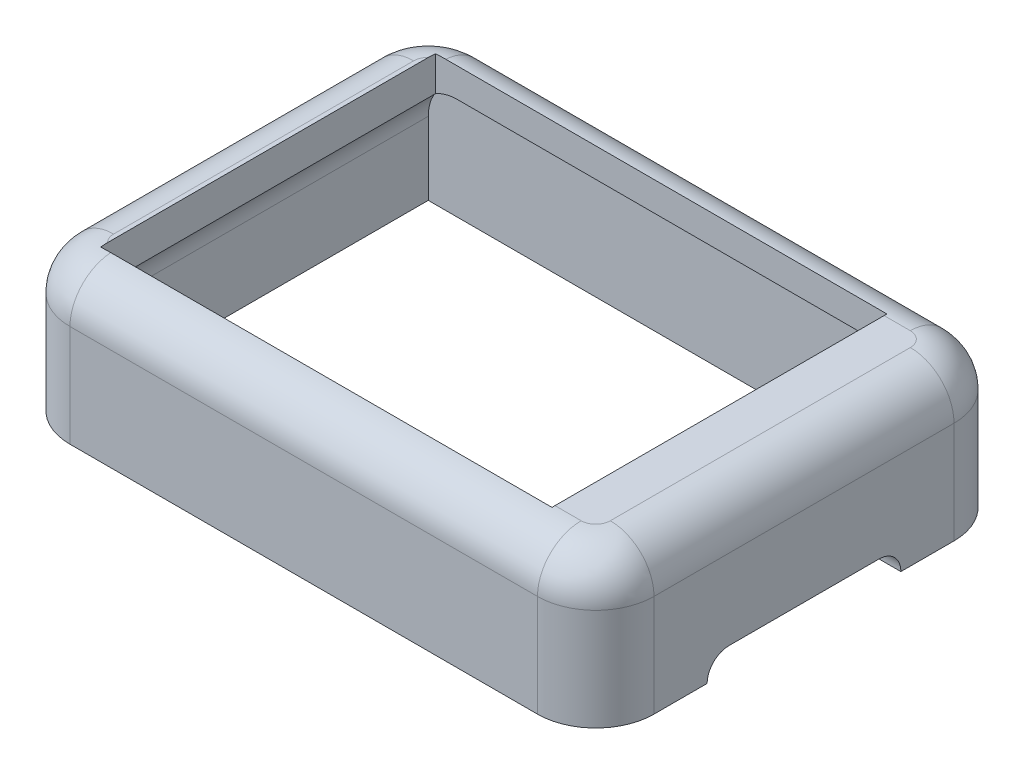
ISO-10303-21;
HEADER;
FILE_DESCRIPTION(('STEP AP214'),'2;1');
FILE_NAME('part.step','',(''),(''),'','','');
FILE_SCHEMA(('AUTOMOTIVE_DESIGN { 1 0 10303 214 1 1 1 1 }'));
ENDSEC;
DATA;
#1=APPLICATION_CONTEXT('core data for automotive mechanical design processes');
#2=APPLICATION_PROTOCOL_DEFINITION('international standard','automotive_design',2000,#1);
#3=PRODUCT_CONTEXT('',#1,'mechanical');
#4=PRODUCT('Part','Part','',(#3));
#5=PRODUCT_RELATED_PRODUCT_CATEGORY('part','',(#4));
#6=PRODUCT_DEFINITION_FORMATION('','',#4);
#7=PRODUCT_DEFINITION_CONTEXT('part definition',#1,'design');
#8=PRODUCT_DEFINITION('design','',#6,#7);
#9=PRODUCT_DEFINITION_SHAPE('','',#8);
#10=(LENGTH_UNIT() NAMED_UNIT(*) SI_UNIT(.MILLI.,.METRE.));
#11=(NAMED_UNIT(*) PLANE_ANGLE_UNIT() SI_UNIT($,.RADIAN.));
#12=(NAMED_UNIT(*) SI_UNIT($,.STERADIAN.) SOLID_ANGLE_UNIT());
#13=UNCERTAINTY_MEASURE_WITH_UNIT(LENGTH_MEASURE(1.E-05),#10,'distance_accuracy_value','');
#14=(GEOMETRIC_REPRESENTATION_CONTEXT(3) GLOBAL_UNCERTAINTY_ASSIGNED_CONTEXT((#13)) GLOBAL_UNIT_ASSIGNED_CONTEXT((#10,
#11,#12)) REPRESENTATION_CONTEXT('',''));
#15=CARTESIAN_POINT('',(0.,0.,0.));
#16=DIRECTION('',(0.,0.,1.));
#17=DIRECTION('',(1.,0.,0.));
#18=AXIS2_PLACEMENT_3D('',#15,#16,#17);
#19=CARTESIAN_POINT('',(0.,10.,0.));
#20=DIRECTION('',(0.,1.,0.));
#21=DIRECTION('',(0.,0.,1.));
#22=AXIS2_PLACEMENT_3D('',#19,#20,#21);
#23=PLANE('',#22);
#24=CARTESIAN_POINT('',(16.05,10.,-10.3));
#25=DIRECTION('',(0.,1.,0.));
#26=DIRECTION('',(0.,0.,1.));
#27=AXIS2_PLACEMENT_3D('',#24,#25,#26);
#28=CIRCLE('',#27,1.);
#29=CARTESIAN_POINT('',(17.05,10.,-10.3));
#30=VERTEX_POINT('',#29);
#31=CARTESIAN_POINT('',(16.05,10.,-11.3));
#32=VERTEX_POINT('',#31);
#33=EDGE_CURVE('E307',#30,#32,#28,.T.);
#34=ORIENTED_EDGE('',*,*,#33,.T.);
#35=DIRECTION('',(-1.,0.,0.));
#36=VECTOR('',#35,1.);
#37=CARTESIAN_POINT('',(-16.05,10.,-11.3));
#38=LINE('',#37,#36);
#39=CARTESIAN_POINT('',(14.25,10.,-11.3));
#40=VERTEX_POINT('',#39);
#41=EDGE_CURVE('E309',#32,#40,#38,.T.);
#42=ORIENTED_EDGE('',*,*,#41,.T.);
#43=DIRECTION('',(0.,0.,-1.));
#44=VECTOR('',#43,1.);
#45=CARTESIAN_POINT('',(14.25,10.,11.5));
#46=LINE('',#45,#44);
#47=CARTESIAN_POINT('',(14.25,10.,11.3));
#48=VERTEX_POINT('',#47);
#49=EDGE_CURVE('E538',#48,#40,#46,.T.);
#50=ORIENTED_EDGE('',*,*,#49,.F.);
#51=DIRECTION('',(1.,0.,0.));
#52=VECTOR('',#51,1.);
#53=CARTESIAN_POINT('',(16.05,10.,11.3));
#54=LINE('',#53,#52);
#55=CARTESIAN_POINT('',(16.05,10.,11.3));
#56=VERTEX_POINT('',#55);
#57=EDGE_CURVE('E301',#48,#56,#54,.T.);
#58=ORIENTED_EDGE('',*,*,#57,.T.);
#59=CARTESIAN_POINT('',(16.05,10.,10.3));
#60=DIRECTION('',(0.,1.,0.));
#61=DIRECTION('',(0.,0.,1.));
#62=AXIS2_PLACEMENT_3D('',#59,#60,#61);
#63=CIRCLE('',#62,1.);
#64=CARTESIAN_POINT('',(17.05,10.,10.3));
#65=VERTEX_POINT('',#64);
#66=EDGE_CURVE('E303',#56,#65,#63,.T.);
#67=ORIENTED_EDGE('',*,*,#66,.T.);
#68=DIRECTION('',(0.,0.,-1.));
#69=VECTOR('',#68,1.);
#70=CARTESIAN_POINT('',(17.05,10.,-10.3));
#71=LINE('',#70,#69);
#72=EDGE_CURVE('E305',#65,#30,#71,.T.);
#73=ORIENTED_EDGE('',*,*,#72,.T.);
#74=EDGE_LOOP('',(#34,#42,#50,#58,#67,#73));
#75=FACE_BOUND('',#74,.T.);
#76=ADVANCED_FACE('F35',(#75),#23,.T.);
#77=CARTESIAN_POINT('',(0.,0.,0.));
#78=DIRECTION('',(0.,-1.,0.));
#79=DIRECTION('',(0.,0.,-1.));
#80=AXIS2_PLACEMENT_3D('',#77,#78,#79);
#81=PLANE('',#80);
#82=DIRECTION('',(1.,0.,0.));
#83=VECTOR('',#82,1.);
#84=CARTESIAN_POINT('',(-20.051,0.,6.65));
#85=LINE('',#84,#83);
#86=CARTESIAN_POINT('',(18.25,0.,6.65));
#87=VERTEX_POINT('',#86);
#88=CARTESIAN_POINT('',(20.05,0.,6.65));
#89=VERTEX_POINT('',#88);
#90=EDGE_CURVE('E227',#87,#89,#85,.T.);
#91=ORIENTED_EDGE('',*,*,#90,.T.);
#92=DIRECTION('',(0.,0.,-1.));
#93=VECTOR('',#92,1.);
#94=CARTESIAN_POINT('',(20.05,0.,14.3));
#95=LINE('',#94,#93);
#96=CARTESIAN_POINT('',(20.05,0.,10.3));
#97=VERTEX_POINT('',#96);
#98=EDGE_CURVE('E241',#97,#89,#95,.T.);
#99=ORIENTED_EDGE('',*,*,#98,.F.);
#100=CARTESIAN_POINT('',(16.05,0.,10.3));
#101=DIRECTION('',(0.,-1.,0.));
#102=DIRECTION('',(0.,0.,-1.));
#103=AXIS2_PLACEMENT_3D('',#100,#101,#102);
#104=CIRCLE('',#103,4.);
#105=CARTESIAN_POINT('',(16.05,0.,14.3));
#106=VERTEX_POINT('',#105);
#107=EDGE_CURVE('E273',#97,#106,#104,.T.);
#108=ORIENTED_EDGE('',*,*,#107,.T.);
#109=DIRECTION('',(1.,0.,0.));
#110=VECTOR('',#109,1.);
#111=CARTESIAN_POINT('',(-20.05,0.,14.3));
#112=LINE('',#111,#110);
#113=CARTESIAN_POINT('',(-16.05,0.,14.3));
#114=VERTEX_POINT('',#113);
#115=EDGE_CURVE('E263',#114,#106,#112,.T.);
#116=ORIENTED_EDGE('',*,*,#115,.F.);
#117=CARTESIAN_POINT('',(-16.05,0.,10.3));
#118=DIRECTION('',(0.,-1.,0.));
#119=DIRECTION('',(0.,0.,-1.));
#120=AXIS2_PLACEMENT_3D('',#117,#118,#119);
#121=CIRCLE('',#120,4.);
#122=CARTESIAN_POINT('',(-20.05,0.,10.3));
#123=VERTEX_POINT('',#122);
#124=EDGE_CURVE('E271',#114,#123,#121,.T.);
#125=ORIENTED_EDGE('',*,*,#124,.T.);
#126=DIRECTION('',(0.,0.,1.));
#127=VECTOR('',#126,1.);
#128=CARTESIAN_POINT('',(-20.05,0.,14.3));
#129=LINE('',#128,#127);
#130=CARTESIAN_POINT('',(-20.05,0.,-10.3));
#131=VERTEX_POINT('',#130);
#132=EDGE_CURVE('E255',#131,#123,#129,.T.);
#133=ORIENTED_EDGE('',*,*,#132,.F.);
#134=CARTESIAN_POINT('',(-16.05,0.,-10.3));
#135=DIRECTION('',(0.,-1.,0.));
#136=DIRECTION('',(0.,0.,-1.));
#137=AXIS2_PLACEMENT_3D('',#134,#135,#136);
#138=CIRCLE('',#137,4.);
#139=CARTESIAN_POINT('',(-16.05,0.,-14.3));
#140=VERTEX_POINT('',#139);
#141=EDGE_CURVE('E278',#131,#140,#138,.T.);
#142=ORIENTED_EDGE('',*,*,#141,.T.);
#143=DIRECTION('',(-1.,0.,0.));
#144=VECTOR('',#143,1.);
#145=CARTESIAN_POINT('',(-20.05,0.,-14.3));
#146=LINE('',#145,#144);
#147=CARTESIAN_POINT('',(16.05,0.,-14.3));
#148=VERTEX_POINT('',#147);
#149=EDGE_CURVE('E251',#148,#140,#146,.T.);
#150=ORIENTED_EDGE('',*,*,#149,.F.);
#151=CARTESIAN_POINT('',(16.05,0.,-10.3));
#152=DIRECTION('',(0.,-1.,0.));
#153=DIRECTION('',(0.,0.,-1.));
#154=AXIS2_PLACEMENT_3D('',#151,#152,#153);
#155=CIRCLE('',#154,4.);
#156=CARTESIAN_POINT('',(20.05,0.,-10.3));
#157=VERTEX_POINT('',#156);
#158=EDGE_CURVE('E275',#148,#157,#155,.T.);
#159=ORIENTED_EDGE('',*,*,#158,.T.);
#160=CARTESIAN_POINT('',(20.05,0.,-6.65));
#161=VERTEX_POINT('',#160);
#162=EDGE_CURVE('E252',#161,#157,#95,.T.);
#163=ORIENTED_EDGE('',*,*,#162,.F.);
#164=DIRECTION('',(1.,0.,0.));
#165=VECTOR('',#164,1.);
#166=CARTESIAN_POINT('',(-20.051,0.,-6.65));
#167=LINE('',#166,#165);
#168=CARTESIAN_POINT('',(18.25,0.,-6.65));
#169=VERTEX_POINT('',#168);
#170=EDGE_CURVE('E245',#161,#169,#167,.F.);
#171=ORIENTED_EDGE('',*,*,#170,.T.);
#172=DIRECTION('',(0.,0.,-1.));
#173=VECTOR('',#172,1.);
#174=CARTESIAN_POINT('',(18.25,0.,12.5));
#175=LINE('',#174,#173);
#176=CARTESIAN_POINT('',(18.25,0.,-12.5));
#177=VERTEX_POINT('',#176);
#178=EDGE_CURVE('E562',#169,#177,#175,.T.);
#179=ORIENTED_EDGE('',*,*,#178,.T.);
#180=DIRECTION('',(-1.,0.,0.));
#181=VECTOR('',#180,1.);
#182=CARTESIAN_POINT('',(18.25,0.,-12.5));
#183=LINE('',#182,#181);
#184=CARTESIAN_POINT('',(-18.25,0.,-12.5));
#185=VERTEX_POINT('',#184);
#186=EDGE_CURVE('E555',#177,#185,#183,.T.);
#187=ORIENTED_EDGE('',*,*,#186,.T.);
#188=DIRECTION('',(0.,0.,1.));
#189=VECTOR('',#188,1.);
#190=CARTESIAN_POINT('',(-18.25,0.,12.5));
#191=LINE('',#190,#189);
#192=CARTESIAN_POINT('',(-18.25,0.,12.5));
#193=VERTEX_POINT('',#192);
#194=EDGE_CURVE('E550',#185,#193,#191,.T.);
#195=ORIENTED_EDGE('',*,*,#194,.T.);
#196=DIRECTION('',(1.,0.,0.));
#197=VECTOR('',#196,1.);
#198=CARTESIAN_POINT('',(18.25,0.,12.5));
#199=LINE('',#198,#197);
#200=CARTESIAN_POINT('',(18.25,0.,12.5));
#201=VERTEX_POINT('',#200);
#202=EDGE_CURVE('E560',#193,#201,#199,.T.);
#203=ORIENTED_EDGE('',*,*,#202,.T.);
#204=EDGE_CURVE('E244',#201,#87,#175,.T.);
#205=ORIENTED_EDGE('',*,*,#204,.T.);
#206=EDGE_LOOP('',(#91,#99,#108,#116,#125,#133,#142,#150,#159,#163,#171,#179,#187,#195,#203,#205));
#207=FACE_BOUND('',#206,.T.);
#208=ADVANCED_FACE('F240',(#207),#81,.T.);
#209=CARTESIAN_POINT('',(20.05,8.,14.3));
#210=DIRECTION('',(-1.,0.,0.));
#211=DIRECTION('',(0.,0.,1.));
#212=AXIS2_PLACEMENT_3D('',#209,#210,#211);
#213=PLANE('',#212);
#214=ORIENTED_EDGE('',*,*,#98,.T.);
#215=CARTESIAN_POINT('',(20.05,0.,5.15));
#216=DIRECTION('',(1.,0.,0.));
#217=DIRECTION('',(0.,0.,-1.));
#218=AXIS2_PLACEMENT_3D('',#215,#216,#217);
#219=CIRCLE('',#218,1.5);
#220=CARTESIAN_POINT('',(20.05,1.5,5.15));
#221=VERTEX_POINT('',#220);
#222=EDGE_CURVE('E224',#221,#89,#219,.T.);
#223=ORIENTED_EDGE('',*,*,#222,.F.);
#224=DIRECTION('',(0.,0.,1.));
#225=VECTOR('',#224,1.);
#226=CARTESIAN_POINT('',(20.05,1.5,-5.15));
#227=LINE('',#226,#225);
#228=CARTESIAN_POINT('',(20.05,1.5,-5.15));
#229=VERTEX_POINT('',#228);
#230=EDGE_CURVE('E235',#229,#221,#227,.T.);
#231=ORIENTED_EDGE('',*,*,#230,.F.);
#232=CARTESIAN_POINT('',(20.05,0.,-5.15));
#233=DIRECTION('',(1.,0.,0.));
#234=DIRECTION('',(0.,0.,-1.));
#235=AXIS2_PLACEMENT_3D('',#232,#233,#234);
#236=CIRCLE('',#235,1.5);
#237=EDGE_CURVE('E591',#161,#229,#236,.T.);
#238=ORIENTED_EDGE('',*,*,#237,.F.);
#239=ORIENTED_EDGE('',*,*,#162,.T.);
#240=DIRECTION('',(0.,-1.,0.));
#241=VECTOR('',#240,1.);
#242=CARTESIAN_POINT('',(20.05,8.,-10.3));
#243=LINE('',#242,#241);
#244=CARTESIAN_POINT('',(20.05,7.,-10.3));
#245=VERTEX_POINT('',#244);
#246=EDGE_CURVE('E286',#157,#245,#243,.F.);
#247=ORIENTED_EDGE('',*,*,#246,.T.);
#248=DIRECTION('',(0.,0.,-1.));
#249=VECTOR('',#248,1.);
#250=CARTESIAN_POINT('',(20.05,7.,10.3));
#251=LINE('',#250,#249);
#252=CARTESIAN_POINT('',(20.05,7.,10.3));
#253=VERTEX_POINT('',#252);
#254=EDGE_CURVE('E463',#245,#253,#251,.F.);
#255=ORIENTED_EDGE('',*,*,#254,.T.);
#256=DIRECTION('',(0.,-1.,0.));
#257=VECTOR('',#256,1.);
#258=CARTESIAN_POINT('',(20.05,8.,10.3));
#259=LINE('',#258,#257);
#260=EDGE_CURVE('E249',#253,#97,#259,.T.);
#261=ORIENTED_EDGE('',*,*,#260,.T.);
#262=EDGE_LOOP('',(#214,#223,#231,#238,#239,#247,#255,#261));
#263=FACE_BOUND('',#262,.T.);
#264=ADVANCED_FACE('F247',(#263),#213,.F.);
#265=CARTESIAN_POINT('',(-20.05,8.,-14.3));
#266=DIRECTION('',(0.,0.,1.));
#267=DIRECTION('',(1.,0.,0.));
#268=AXIS2_PLACEMENT_3D('',#265,#266,#267);
#269=PLANE('',#268);
#270=DIRECTION('',(0.,-1.,0.));
#271=VECTOR('',#270,1.);
#272=CARTESIAN_POINT('',(-16.05,8.,-14.3));
#273=LINE('',#272,#271);
#274=CARTESIAN_POINT('',(-16.05,7.,-14.3));
#275=VERTEX_POINT('',#274);
#276=EDGE_CURVE('E282',#140,#275,#273,.F.);
#277=ORIENTED_EDGE('',*,*,#276,.T.);
#278=DIRECTION('',(-1.,0.,0.));
#279=VECTOR('',#278,1.);
#280=CARTESIAN_POINT('',(16.05,7.,-14.3));
#281=LINE('',#280,#279);
#282=CARTESIAN_POINT('',(16.05,7.,-14.3));
#283=VERTEX_POINT('',#282);
#284=EDGE_CURVE('E457',#275,#283,#281,.F.);
#285=ORIENTED_EDGE('',*,*,#284,.T.);
#286=DIRECTION('',(0.,-1.,0.));
#287=VECTOR('',#286,1.);
#288=CARTESIAN_POINT('',(16.05,8.,-14.3));
#289=LINE('',#288,#287);
#290=EDGE_CURVE('E280',#283,#148,#289,.T.);
#291=ORIENTED_EDGE('',*,*,#290,.T.);
#292=ORIENTED_EDGE('',*,*,#149,.T.);
#293=EDGE_LOOP('',(#277,#285,#291,#292));
#294=FACE_BOUND('',#293,.T.);
#295=ADVANCED_FACE('F394',(#294),#269,.F.);
#296=CARTESIAN_POINT('',(-20.05,8.,14.3));
#297=DIRECTION('',(1.,0.,0.));
#298=DIRECTION('',(0.,0.,-1.));
#299=AXIS2_PLACEMENT_3D('',#296,#297,#298);
#300=PLANE('',#299);
#301=DIRECTION('',(0.,-1.,0.));
#302=VECTOR('',#301,1.);
#303=CARTESIAN_POINT('',(-20.05,8.,10.3));
#304=LINE('',#303,#302);
#305=CARTESIAN_POINT('',(-20.05,7.,10.3));
#306=VERTEX_POINT('',#305);
#307=EDGE_CURVE('E266',#123,#306,#304,.F.);
#308=ORIENTED_EDGE('',*,*,#307,.T.);
#309=DIRECTION('',(0.,0.,1.));
#310=VECTOR('',#309,1.);
#311=CARTESIAN_POINT('',(-20.05,7.,-10.3));
#312=LINE('',#311,#310);
#313=CARTESIAN_POINT('',(-20.05,7.,-10.3));
#314=VERTEX_POINT('',#313);
#315=EDGE_CURVE('E311',#306,#314,#312,.F.);
#316=ORIENTED_EDGE('',*,*,#315,.T.);
#317=DIRECTION('',(0.,-1.,0.));
#318=VECTOR('',#317,1.);
#319=CARTESIAN_POINT('',(-20.05,8.,-10.3));
#320=LINE('',#319,#318);
#321=EDGE_CURVE('E269',#314,#131,#320,.T.);
#322=ORIENTED_EDGE('',*,*,#321,.T.);
#323=ORIENTED_EDGE('',*,*,#132,.T.);
#324=EDGE_LOOP('',(#308,#316,#322,#323));
#325=FACE_BOUND('',#324,.T.);
#326=ADVANCED_FACE('F390',(#325),#300,.F.);
#327=CARTESIAN_POINT('',(-20.05,8.,14.3));
#328=DIRECTION('',(0.,0.,-1.));
#329=DIRECTION('',(-1.,0.,0.));
#330=AXIS2_PLACEMENT_3D('',#327,#328,#329);
#331=PLANE('',#330);
#332=DIRECTION('',(0.,-1.,0.));
#333=VECTOR('',#332,1.);
#334=CARTESIAN_POINT('',(16.05,8.,14.3));
#335=LINE('',#334,#333);
#336=CARTESIAN_POINT('',(16.05,7.,14.3));
#337=VERTEX_POINT('',#336);
#338=EDGE_CURVE('E291',#106,#337,#335,.F.);
#339=ORIENTED_EDGE('',*,*,#338,.T.);
#340=DIRECTION('',(1.,0.,0.));
#341=VECTOR('',#340,1.);
#342=CARTESIAN_POINT('',(-16.05,7.,14.3));
#343=LINE('',#342,#341);
#344=CARTESIAN_POINT('',(-16.05,7.,14.3));
#345=VERTEX_POINT('',#344);
#346=EDGE_CURVE('E474',#337,#345,#343,.F.);
#347=ORIENTED_EDGE('',*,*,#346,.T.);
#348=DIRECTION('',(0.,-1.,0.));
#349=VECTOR('',#348,1.);
#350=CARTESIAN_POINT('',(-16.05,8.,14.3));
#351=LINE('',#350,#349);
#352=EDGE_CURVE('E289',#345,#114,#351,.T.);
#353=ORIENTED_EDGE('',*,*,#352,.T.);
#354=ORIENTED_EDGE('',*,*,#115,.T.);
#355=EDGE_LOOP('',(#339,#347,#353,#354));
#356=FACE_BOUND('',#355,.T.);
#357=ADVANCED_FACE('F384',(#356),#331,.F.);
#358=CARTESIAN_POINT('',(-18.25,8.,12.5));
#359=DIRECTION('',(1.,0.,0.));
#360=DIRECTION('',(0.,0.,-1.));
#361=AXIS2_PLACEMENT_3D('',#358,#359,#360);
#362=PLANE('',#361);
#363=DIRECTION('',(0.,-1.,0.));
#364=VECTOR('',#363,1.);
#365=CARTESIAN_POINT('',(-18.25,8.,-12.5));
#366=LINE('',#365,#364);
#367=CARTESIAN_POINT('',(-18.25,5.,-12.5));
#368=VERTEX_POINT('',#367);
#369=EDGE_CURVE('E557',#368,#185,#366,.T.);
#370=ORIENTED_EDGE('',*,*,#369,.F.);
#371=DIRECTION('',(0.,0.,1.));
#372=VECTOR('',#371,1.);
#373=CARTESIAN_POINT('',(-18.25,5.,12.5));
#374=LINE('',#373,#372);
#375=CARTESIAN_POINT('',(-18.25,5.,12.5));
#376=VERTEX_POINT('',#375);
#377=EDGE_CURVE('E478',#368,#376,#374,.T.);
#378=ORIENTED_EDGE('',*,*,#377,.T.);
#379=DIRECTION('',(0.,-1.,0.));
#380=VECTOR('',#379,1.);
#381=CARTESIAN_POINT('',(-18.25,8.,12.5));
#382=LINE('',#381,#380);
#383=EDGE_CURVE('E257',#376,#193,#382,.T.);
#384=ORIENTED_EDGE('',*,*,#383,.T.);
#385=ORIENTED_EDGE('',*,*,#194,.F.);
#386=EDGE_LOOP('',(#370,#378,#384,#385));
#387=FACE_BOUND('',#386,.T.);
#388=ADVANCED_FACE('F380',(#387),#362,.T.);
#389=CARTESIAN_POINT('',(18.25,8.,12.5));
#390=DIRECTION('',(0.,0.,-1.));
#391=DIRECTION('',(-1.,0.,0.));
#392=AXIS2_PLACEMENT_3D('',#389,#390,#391);
#393=PLANE('',#392);
#394=ORIENTED_EDGE('',*,*,#383,.F.);
#395=CARTESIAN_POINT('',(-15.25,5.,12.5));
#396=DIRECTION('',(0.,0.,-1.));
#397=DIRECTION('',(-1.,0.,0.));
#398=AXIS2_PLACEMENT_3D('',#395,#396,#397);
#399=CIRCLE('',#398,3.);
#400=CARTESIAN_POINT('',(-15.25,8.,12.5));
#401=VERTEX_POINT('',#400);
#402=EDGE_CURVE('E501',#376,#401,#399,.T.);
#403=ORIENTED_EDGE('',*,*,#402,.T.);
#404=DIRECTION('',(1.,0.,0.));
#405=VECTOR('',#404,1.);
#406=CARTESIAN_POINT('',(18.25,8.,12.5));
#407=LINE('',#406,#405);
#408=CARTESIAN_POINT('',(15.25,8.,12.5));
#409=VERTEX_POINT('',#408);
#410=EDGE_CURVE('E551',#401,#409,#407,.T.);
#411=ORIENTED_EDGE('',*,*,#410,.T.);
#412=CARTESIAN_POINT('',(15.25,5.,12.5));
#413=DIRECTION('',(0.,0.,-1.));
#414=DIRECTION('',(-1.,0.,0.));
#415=AXIS2_PLACEMENT_3D('',#412,#413,#414);
#416=CIRCLE('',#415,3.);
#417=CARTESIAN_POINT('',(18.25,5.,12.5));
#418=VERTEX_POINT('',#417);
#419=EDGE_CURVE('E499',#409,#418,#416,.T.);
#420=ORIENTED_EDGE('',*,*,#419,.T.);
#421=DIRECTION('',(0.,-1.,0.));
#422=VECTOR('',#421,1.);
#423=CARTESIAN_POINT('',(18.25,8.,12.5));
#424=LINE('',#423,#422);
#425=EDGE_CURVE('E569',#418,#201,#424,.T.);
#426=ORIENTED_EDGE('',*,*,#425,.T.);
#427=ORIENTED_EDGE('',*,*,#202,.F.);
#428=EDGE_LOOP('',(#394,#403,#411,#420,#426,#427));
#429=FACE_BOUND('',#428,.T.);
#430=ADVANCED_FACE('F376',(#429),#393,.T.);
#431=CARTESIAN_POINT('',(18.25,8.,12.5));
#432=DIRECTION('',(-1.,0.,0.));
#433=DIRECTION('',(0.,0.,1.));
#434=AXIS2_PLACEMENT_3D('',#431,#432,#433);
#435=PLANE('',#434);
#436=CARTESIAN_POINT('',(18.25,0.,5.15));
#437=DIRECTION('',(-1.,0.,0.));
#438=DIRECTION('',(0.,0.,1.));
#439=AXIS2_PLACEMENT_3D('',#436,#437,#438);
#440=CIRCLE('',#439,1.5);
#441=CARTESIAN_POINT('',(18.25,1.5,5.15));
#442=VERTEX_POINT('',#441);
#443=EDGE_CURVE('E587',#442,#87,#440,.F.);
#444=ORIENTED_EDGE('',*,*,#443,.T.);
#445=ORIENTED_EDGE('',*,*,#204,.F.);
#446=ORIENTED_EDGE('',*,*,#425,.F.);
#447=DIRECTION('',(0.,0.,-1.));
#448=VECTOR('',#447,1.);
#449=CARTESIAN_POINT('',(18.25,5.,12.5));
#450=LINE('',#449,#448);
#451=CARTESIAN_POINT('',(18.25,5.,-12.5));
#452=VERTEX_POINT('',#451);
#453=EDGE_CURVE('E513',#418,#452,#450,.T.);
#454=ORIENTED_EDGE('',*,*,#453,.T.);
#455=DIRECTION('',(0.,-1.,0.));
#456=VECTOR('',#455,1.);
#457=CARTESIAN_POINT('',(18.25,8.,-12.5));
#458=LINE('',#457,#456);
#459=EDGE_CURVE('E567',#452,#177,#458,.T.);
#460=ORIENTED_EDGE('',*,*,#459,.T.);
#461=ORIENTED_EDGE('',*,*,#178,.F.);
#462=CARTESIAN_POINT('',(18.25,0.,-5.15));
#463=DIRECTION('',(-1.,0.,0.));
#464=DIRECTION('',(0.,0.,1.));
#465=AXIS2_PLACEMENT_3D('',#462,#463,#464);
#466=CIRCLE('',#465,1.5);
#467=CARTESIAN_POINT('',(18.25,1.5,-5.15));
#468=VERTEX_POINT('',#467);
#469=EDGE_CURVE('E589',#169,#468,#466,.F.);
#470=ORIENTED_EDGE('',*,*,#469,.T.);
#471=DIRECTION('',(0.,0.,1.));
#472=VECTOR('',#471,1.);
#473=CARTESIAN_POINT('',(18.25,1.5,-5.15));
#474=LINE('',#473,#472);
#475=EDGE_CURVE('E482',#468,#442,#474,.T.);
#476=ORIENTED_EDGE('',*,*,#475,.T.);
#477=EDGE_LOOP('',(#444,#445,#446,#454,#460,#461,#470,#476));
#478=FACE_BOUND('',#477,.T.);
#479=ADVANCED_FACE('F372',(#478),#435,.T.);
#480=CARTESIAN_POINT('',(18.25,8.,-12.5));
#481=DIRECTION('',(0.,0.,1.));
#482=DIRECTION('',(1.,0.,0.));
#483=AXIS2_PLACEMENT_3D('',#480,#481,#482);
#484=PLANE('',#483);
#485=DIRECTION('',(-1.,0.,0.));
#486=VECTOR('',#485,1.);
#487=CARTESIAN_POINT('',(18.25,8.,-12.5));
#488=LINE('',#487,#486);
#489=CARTESIAN_POINT('',(15.25,8.,-12.5));
#490=VERTEX_POINT('',#489);
#491=CARTESIAN_POINT('',(-15.25,8.,-12.5));
#492=VERTEX_POINT('',#491);
#493=EDGE_CURVE('E554',#490,#492,#488,.T.);
#494=ORIENTED_EDGE('',*,*,#493,.T.);
#495=CARTESIAN_POINT('',(-15.25,5.,-12.5));
#496=DIRECTION('',(0.,0.,1.));
#497=DIRECTION('',(1.,0.,0.));
#498=AXIS2_PLACEMENT_3D('',#495,#496,#497);
#499=CIRCLE('',#498,3.);
#500=EDGE_CURVE('E511',#492,#368,#499,.T.);
#501=ORIENTED_EDGE('',*,*,#500,.T.);
#502=ORIENTED_EDGE('',*,*,#369,.T.);
#503=ORIENTED_EDGE('',*,*,#186,.F.);
#504=ORIENTED_EDGE('',*,*,#459,.F.);
#505=CARTESIAN_POINT('',(15.25,5.,-12.5));
#506=DIRECTION('',(0.,0.,1.));
#507=DIRECTION('',(1.,0.,0.));
#508=AXIS2_PLACEMENT_3D('',#505,#506,#507);
#509=CIRCLE('',#508,3.);
#510=EDGE_CURVE('E509',#452,#490,#509,.T.);
#511=ORIENTED_EDGE('',*,*,#510,.T.);
#512=EDGE_LOOP('',(#494,#501,#502,#503,#504,#511));
#513=FACE_BOUND('',#512,.T.);
#514=ADVANCED_FACE('F365',(#513),#484,.T.);
#515=DIRECTION('',(0.,0.,1.));
#516=VECTOR('',#515,1.);
#517=CARTESIAN_POINT('',(-16.75,10.,11.5));
#518=LINE('',#517,#516);
#519=CARTESIAN_POINT('',(-16.75,10.,-11.0141428428543));
#520=VERTEX_POINT('',#519);
#521=CARTESIAN_POINT('',(-16.75,10.,11.0141428428543));
#522=VERTEX_POINT('',#521);
#523=EDGE_CURVE('E535',#520,#522,#518,.T.);
#524=ORIENTED_EDGE('',*,*,#523,.F.);
#525=CARTESIAN_POINT('',(-16.05,10.,-10.3));
#526=DIRECTION('',(0.,1.,0.));
#527=DIRECTION('',(0.,0.,1.));
#528=AXIS2_PLACEMENT_3D('',#525,#526,#527);
#529=CIRCLE('',#528,1.);
#530=CARTESIAN_POINT('',(-17.05,10.,-10.3));
#531=VERTEX_POINT('',#530);
#532=EDGE_CURVE('E299',#520,#531,#529,.T.);
#533=ORIENTED_EDGE('',*,*,#532,.T.);
#534=DIRECTION('',(0.,0.,1.));
#535=VECTOR('',#534,1.);
#536=CARTESIAN_POINT('',(-17.05,10.,10.3));
#537=LINE('',#536,#535);
#538=CARTESIAN_POINT('',(-17.05,10.,10.3));
#539=VERTEX_POINT('',#538);
#540=EDGE_CURVE('E296',#531,#539,#537,.T.);
#541=ORIENTED_EDGE('',*,*,#540,.T.);
#542=CARTESIAN_POINT('',(-16.05,10.,10.3));
#543=DIRECTION('',(0.,1.,0.));
#544=DIRECTION('',(0.,0.,1.));
#545=AXIS2_PLACEMENT_3D('',#542,#543,#544);
#546=CIRCLE('',#545,1.);
#547=EDGE_CURVE('E294',#539,#522,#546,.T.);
#548=ORIENTED_EDGE('',*,*,#547,.T.);
#549=EDGE_LOOP('',(#524,#533,#541,#548));
#550=FACE_BOUND('',#549,.T.);
#551=ADVANCED_FACE('F361',(#550),#23,.T.);
#552=CARTESIAN_POINT('',(0.,8.,0.));
#553=DIRECTION('',(0.,1.,0.));
#554=DIRECTION('',(0.,0.,1.));
#555=AXIS2_PLACEMENT_3D('',#552,#553,#554);
#556=PLANE('',#555);
#557=ORIENTED_EDGE('',*,*,#410,.F.);
#558=DIRECTION('',(0.,0.,1.));
#559=VECTOR('',#558,1.);
#560=CARTESIAN_POINT('',(-15.25,8.,0.));
#561=LINE('',#560,#559);
#562=CARTESIAN_POINT('',(-15.25,8.,11.5));
#563=VERTEX_POINT('',#562);
#564=EDGE_CURVE('E507',#401,#563,#561,.F.);
#565=ORIENTED_EDGE('',*,*,#564,.T.);
#566=DIRECTION('',(1.,0.,0.));
#567=VECTOR('',#566,1.);
#568=CARTESIAN_POINT('',(14.25,8.,11.5));
#569=LINE('',#568,#567);
#570=CARTESIAN_POINT('',(14.25,8.,11.5));
#571=VERTEX_POINT('',#570);
#572=EDGE_CURVE('E496',#563,#571,#569,.T.);
#573=ORIENTED_EDGE('',*,*,#572,.T.);
#574=DIRECTION('',(0.,0.,-1.));
#575=VECTOR('',#574,1.);
#576=CARTESIAN_POINT('',(14.25,8.,11.5));
#577=LINE('',#576,#575);
#578=CARTESIAN_POINT('',(14.25,8.,-11.5));
#579=VERTEX_POINT('',#578);
#580=EDGE_CURVE('E534',#571,#579,#577,.T.);
#581=ORIENTED_EDGE('',*,*,#580,.T.);
#582=DIRECTION('',(-1.,0.,0.));
#583=VECTOR('',#582,1.);
#584=CARTESIAN_POINT('',(14.25,8.,-11.5));
#585=LINE('',#584,#583);
#586=CARTESIAN_POINT('',(-15.25,8.,-11.5));
#587=VERTEX_POINT('',#586);
#588=EDGE_CURVE('E528',#579,#587,#585,.T.);
#589=ORIENTED_EDGE('',*,*,#588,.T.);
#590=DIRECTION('',(0.,0.,1.));
#591=VECTOR('',#590,1.);
#592=CARTESIAN_POINT('',(-15.25,8.,0.));
#593=LINE('',#592,#591);
#594=EDGE_CURVE('E505',#587,#492,#593,.F.);
#595=ORIENTED_EDGE('',*,*,#594,.T.);
#596=ORIENTED_EDGE('',*,*,#493,.F.);
#597=DIRECTION('',(0.,0.,-1.));
#598=VECTOR('',#597,1.);
#599=CARTESIAN_POINT('',(15.25,8.,0.));
#600=LINE('',#599,#598);
#601=EDGE_CURVE('E503',#490,#409,#600,.F.);
#602=ORIENTED_EDGE('',*,*,#601,.T.);
#603=EDGE_LOOP('',(#557,#565,#573,#581,#589,#595,#596,#602));
#604=FACE_BOUND('',#603,.T.);
#605=ADVANCED_FACE('F358',(#604),#556,.F.);
#606=CARTESIAN_POINT('',(-16.75,10.,11.5));
#607=DIRECTION('',(1.,0.,0.));
#608=DIRECTION('',(0.,0.,-1.));
#609=AXIS2_PLACEMENT_3D('',#606,#607,#608);
#610=PLANE('',#609);
#611=DIRECTION('',(0.,-1.,0.));
#612=VECTOR('',#611,1.);
#613=CARTESIAN_POINT('',(-16.75,10.,-11.5));
#614=LINE('',#613,#612);
#615=CARTESIAN_POINT('',(-16.75,9.97464095276892,-11.5));
#616=VERTEX_POINT('',#615);
#617=CARTESIAN_POINT('',(-16.75,7.59807621135332,-11.5));
#618=VERTEX_POINT('',#617);
#619=EDGE_CURVE('E57',#616,#618,#614,.T.);
#620=ORIENTED_EDGE('',*,*,#619,.F.);
#621=CARTESIAN_POINT('',(-16.75,9.97464095276892,-11.5));
#622=CARTESIAN_POINT('',(-16.75,9.98124820384842,-11.4417475849361));
#623=CARTESIAN_POINT('',(-16.75,9.98640817536852,-11.3833480717274));
#624=CARTESIAN_POINT('',(-16.75,9.99417859070695,-11.2664451831716));
#625=CARTESIAN_POINT('',(-16.75,9.99679198700516,-11.2079420070728));
#626=CARTESIAN_POINT('',(-16.75,9.9998272340721,-11.0909157538721));
#627=CARTESIAN_POINT('',(-16.75,10.0002501862218,-11.0323927015712));
#628=CARTESIAN_POINT('',(-16.75,9.9994818405531,-10.9153425865072));
#629=CARTESIAN_POINT('',(-16.75,9.99828997614412,-10.856815529545));
#630=CARTESIAN_POINT('',(-16.75,9.99510624270527,-10.7399238767255));
#631=CARTESIAN_POINT('',(-16.75,9.99311623780615,-10.6815592192056));
#632=CARTESIAN_POINT('',(-16.75,9.9893794010597,-10.5648345302978));
#633=CARTESIAN_POINT('',(-16.75,9.98763250813846,-10.5064745014424));
#634=CARTESIAN_POINT('',(-16.75,9.98590196417551,-10.4188947799886));
#635=CARTESIAN_POINT('',(-16.75,9.98547342132451,-10.389684766461));
#636=CARTESIAN_POINT('',(-16.75,9.98497298458947,-10.3312613891999));
#637=CARTESIAN_POINT('',(-16.75,9.98490109294444,-10.3020480254464));
#638=CARTESIAN_POINT('',(-16.75,9.98512942874594,-10.2436013198459));
#639=CARTESIAN_POINT('',(-16.75,9.98542993145132,-10.214367979203));
#640=CARTESIAN_POINT('',(-16.75,9.98634674676009,-10.1559059126267));
#641=CARTESIAN_POINT('',(-16.75,9.98696306190975,-10.1266771867323));
#642=CARTESIAN_POINT('',(-16.75,9.98770889252012,-10.0974524963377));
#643=B_SPLINE_CURVE_WITH_KNOTS('',3,(#621,#622,#623,#624,#625,#626,#627,#628,#629,#630,#631,
#632,#633,#634,#635,#636,#637,#638,#639,#640,#641,#642),.UNSPECIFIED.,.F.,.F.,(4,2,2,2,2,2,2,2,
2,2,4),(0.,0.175835573596207,0.351467041350012,0.527010190961571,0.702614949332252,
0.877811932989435,1.05296482440806,1.14060221509481,1.22824015596109,1.31594291390597,
1.40364637897213),.UNSPECIFIED.);
#644=EDGE_CURVE('E345',#616,#520,#643,.T.);
#645=ORIENTED_EDGE('',*,*,#644,.T.);
#646=ORIENTED_EDGE('',*,*,#523,.T.);
#647=CARTESIAN_POINT('',(-16.75,10.,11.0141428428543));
#648=CARTESIAN_POINT('',(-16.75,10.0000080578642,11.0563259355866));
#649=CARTESIAN_POINT('',(-16.75,9.99954551133805,11.0985105347835));
#650=CARTESIAN_POINT('',(-16.75,9.99751079875595,11.1828619740472));
#651=CARTESIAN_POINT('',(-16.75,9.99593837639413,11.2250288077604));
#652=CARTESIAN_POINT('',(-16.75,9.98932533422,11.3510324050192));
#653=CARTESIAN_POINT('',(-16.75,9.98239223297945,11.4347832220507));
#654=CARTESIAN_POINT('',(-16.75,9.96267443622703,11.6016866606164));
#655=CARTESIAN_POINT('',(-16.75,9.94988421809742,11.6848386421869));
#656=CARTESIAN_POINT('',(-16.75,9.91804558875267,11.8503334448357));
#657=CARTESIAN_POINT('',(-16.75,9.89896821089325,11.9326706685595));
#658=CARTESIAN_POINT('',(-16.75,9.87660223030276,12.0141428428543));
#659=B_SPLINE_CURVE_WITH_KNOTS('',3,(#647,#648,#649,#650,#651,#652,#653,#654,#655,#656,#657,
#658),.UNSPECIFIED.,.F.,.F.,(4,2,2,2,2,4),(0.,0.126547098964234,0.253123431264765,
0.505045018603249,0.757204630962779,1.01054264298982),.UNSPECIFIED.);
#660=CARTESIAN_POINT('',(-16.75,9.97464095276892,11.5));
#661=VERTEX_POINT('',#660);
#662=EDGE_CURVE('E323',#522,#661,#659,.T.);
#663=ORIENTED_EDGE('',*,*,#662,.T.);
#664=DIRECTION('',(0.,-1.,0.));
#665=VECTOR('',#664,1.);
#666=CARTESIAN_POINT('',(-16.75,10.,11.5));
#667=LINE('',#666,#665);
#668=CARTESIAN_POINT('',(-16.75,7.59807621135332,11.5));
#669=VERTEX_POINT('',#668);
#670=EDGE_CURVE('E522',#661,#669,#667,.T.);
#671=ORIENTED_EDGE('',*,*,#670,.T.);
#672=DIRECTION('',(0.,0.,1.));
#673=VECTOR('',#672,1.);
#674=CARTESIAN_POINT('',(-16.75,7.59807621135332,11.5));
#675=LINE('',#674,#673);
#676=EDGE_CURVE('E43',#669,#618,#675,.F.);
#677=ORIENTED_EDGE('',*,*,#676,.T.);
#678=EDGE_LOOP('',(#620,#645,#646,#663,#671,#677));
#679=FACE_BOUND('',#678,.T.);
#680=ADVANCED_FACE('F352',(#679),#610,.T.);
#681=CARTESIAN_POINT('',(14.25,10.,11.5));
#682=DIRECTION('',(0.,0.,-1.));
#683=DIRECTION('',(-1.,0.,0.));
#684=AXIS2_PLACEMENT_3D('',#681,#682,#683);
#685=PLANE('',#684);
#686=CARTESIAN_POINT('',(-16.75,9.97464095276892,11.5));
#687=CARTESIAN_POINT('',(-16.6918049125923,9.97847344444074,11.5));
#688=CARTESIAN_POINT('',(-16.6335663909451,9.98151816214716,11.5));
#689=CARTESIAN_POINT('',(-16.5170488820192,9.98637457794688,11.5));
#690=CARTESIAN_POINT('',(-16.4587699056773,9.98818653238572,11.5));
#691=CARTESIAN_POINT('',(-16.3422346182464,9.9909202978963,11.5));
#692=CARTESIAN_POINT('',(-16.2839783200155,9.99184273369152,11.5));
#693=CARTESIAN_POINT('',(-16.1674546345449,9.9930440610681,11.5));
#694=CARTESIAN_POINT('',(-16.1091872467862,9.99332289922812,11.5));
#695=CARTESIAN_POINT('',(-15.99265260258,9.9933288724908,11.5));
#696=CARTESIAN_POINT('',(-15.9343853461327,9.99305600907386,11.5));
#697=CARTESIAN_POINT('',(-15.8178618198631,9.99186848394346,11.5));
#698=CARTESIAN_POINT('',(-15.7596055495308,9.99095387532926,11.5));
#699=CARTESIAN_POINT('',(-15.6430701156858,9.98823899043836,11.5));
#700=CARTESIAN_POINT('',(-15.5847909648865,9.986438091743,11.5));
#701=CARTESIAN_POINT('',(-15.4682727589693,9.98160748222776,11.5));
#702=CARTESIAN_POINT('',(-15.410033714624,9.97857751758951,11.5));
#703=CARTESIAN_POINT('',(-15.3518377753079,9.9747618589638,11.5));
#704=B_SPLINE_CURVE_WITH_KNOTS('',3,(#686,#687,#688,#689,#690,#691,#692,#693,#694,#695,#696,
#697,#698,#699,#700,#701,#702,#703),.UNSPECIFIED.,.F.,.F.,(4,2,2,2,2,2,2,2,4),(0.,
0.174946090514324,0.349855790938806,0.524642559762587,0.699443836109943,0.874244643410602,
1.04903098905363,1.22394025817615,1.39888566677995),.UNSPECIFIED.);
#705=CARTESIAN_POINT('',(-16.05,9.99332590941915,11.5));
#706=VERTEX_POINT('',#705);
#707=EDGE_CURVE('E467',#661,#706,#704,.T.);
#708=ORIENTED_EDGE('',*,*,#707,.T.);
#709=DIRECTION('',(-1.,0.,0.));
#710=VECTOR('',#709,1.);
#711=CARTESIAN_POINT('',(0.,9.99332590941915,11.5));
#712=LINE('',#711,#710);
#713=CARTESIAN_POINT('',(14.25,9.99332590941915,11.5));
#714=VERTEX_POINT('',#713);
#715=EDGE_CURVE('E472',#706,#714,#712,.F.);
#716=ORIENTED_EDGE('',*,*,#715,.T.);
#717=DIRECTION('',(0.,-1.,0.));
#718=VECTOR('',#717,1.);
#719=CARTESIAN_POINT('',(14.25,10.,11.5));
#720=LINE('',#719,#718);
#721=EDGE_CURVE('E546',#714,#571,#720,.T.);
#722=ORIENTED_EDGE('',*,*,#721,.T.);
#723=ORIENTED_EDGE('',*,*,#572,.F.);
#724=CARTESIAN_POINT('',(-15.25,5.,11.5));
#725=DIRECTION('',(0.,0.,-1.));
#726=DIRECTION('',(-1.,0.,0.));
#727=AXIS2_PLACEMENT_3D('',#724,#725,#726);
#728=CIRCLE('',#727,3.);
#729=EDGE_CURVE('E516',#563,#669,#728,.F.);
#730=ORIENTED_EDGE('',*,*,#729,.T.);
#731=ORIENTED_EDGE('',*,*,#670,.F.);
#732=EDGE_LOOP('',(#708,#716,#722,#723,#730,#731));
#733=FACE_BOUND('',#732,.T.);
#734=ADVANCED_FACE('F357',(#733),#685,.T.);
#735=CARTESIAN_POINT('',(14.25,10.,11.5));
#736=DIRECTION('',(-1.,0.,0.));
#737=DIRECTION('',(0.,0.,1.));
#738=AXIS2_PLACEMENT_3D('',#735,#736,#737);
#739=PLANE('',#738);
#740=ORIENTED_EDGE('',*,*,#49,.T.);
#741=CARTESIAN_POINT('',(14.25,7.,-11.3));
#742=DIRECTION('',(-1.,0.,0.));
#743=DIRECTION('',(0.,0.,1.));
#744=AXIS2_PLACEMENT_3D('',#741,#742,#743);
#745=CIRCLE('',#744,3.);
#746=CARTESIAN_POINT('',(14.25,9.99332590941915,-11.5));
#747=VERTEX_POINT('',#746);
#748=EDGE_CURVE('E453',#40,#747,#745,.T.);
#749=ORIENTED_EDGE('',*,*,#748,.T.);
#750=DIRECTION('',(0.,-1.,0.));
#751=VECTOR('',#750,1.);
#752=CARTESIAN_POINT('',(14.25,10.,-11.5));
#753=LINE('',#752,#751);
#754=EDGE_CURVE('E544',#747,#579,#753,.T.);
#755=ORIENTED_EDGE('',*,*,#754,.T.);
#756=ORIENTED_EDGE('',*,*,#580,.F.);
#757=ORIENTED_EDGE('',*,*,#721,.F.);
#758=CARTESIAN_POINT('',(14.25,7.,11.3));
#759=DIRECTION('',(-1.,0.,0.));
#760=DIRECTION('',(0.,0.,1.));
#761=AXIS2_PLACEMENT_3D('',#758,#759,#760);
#762=CIRCLE('',#761,3.);
#763=EDGE_CURVE('E458',#714,#48,#762,.T.);
#764=ORIENTED_EDGE('',*,*,#763,.T.);
#765=EDGE_LOOP('',(#740,#749,#755,#756,#757,#764));
#766=FACE_BOUND('',#765,.T.);
#767=ADVANCED_FACE('F604',(#766),#739,.T.);
#768=CARTESIAN_POINT('',(14.25,10.,-11.5));
#769=DIRECTION('',(0.,0.,1.));
#770=DIRECTION('',(1.,0.,0.));
#771=AXIS2_PLACEMENT_3D('',#768,#769,#770);
#772=PLANE('',#771);
#773=DIRECTION('',(1.,0.,0.));
#774=VECTOR('',#773,1.);
#775=CARTESIAN_POINT('',(0.,9.99332590941915,-11.5));
#776=LINE('',#775,#774);
#777=CARTESIAN_POINT('',(-16.05,9.99332590941915,-11.5));
#778=VERTEX_POINT('',#777);
#779=EDGE_CURVE('E314',#747,#778,#776,.F.);
#780=ORIENTED_EDGE('',*,*,#779,.T.);
#781=CARTESIAN_POINT('',(-16.05,9.99332590941915,-11.5));
#782=CARTESIAN_POINT('',(-16.1002199556015,9.99330993846622,-11.5));
#783=CARTESIAN_POINT('',(-16.1504409862977,9.99311518286952,-11.5));
#784=CARTESIAN_POINT('',(-16.2508837936633,9.99224791253283,-11.5));
#785=CARTESIAN_POINT('',(-16.3011055698978,9.99157534964371,-11.5));
#786=CARTESIAN_POINT('',(-16.4014493147363,9.98963395202888,-11.5));
#787=CARTESIAN_POINT('',(-16.4515713024407,9.98836617649132,-11.5));
#788=CARTESIAN_POINT('',(-16.5517896900885,9.98503081588945,-11.5));
#789=CARTESIAN_POINT('',(-16.6018860900843,9.98296323247064,-11.5));
#790=CARTESIAN_POINT('',(-16.7020956006818,9.9777990082511,-11.5));
#791=CARTESIAN_POINT('',(-16.7522086417743,9.97470097538053,-11.5));
#792=CARTESIAN_POINT('',(-16.8523385841578,9.96724867112192,-11.5));
#793=CARTESIAN_POINT('',(-16.9023554933513,9.96289450786944,-11.5));
#794=CARTESIAN_POINT('',(-17.0023267642099,9.95270932507694,-11.5));
#795=CARTESIAN_POINT('',(-17.0522808779271,9.94687582594357,-11.5));
#796=CARTESIAN_POINT('',(-17.151984788957,9.93355641047689,-11.5));
#797=CARTESIAN_POINT('',(-17.2017345100371,9.92606992615125,-11.5));
#798=CARTESIAN_POINT('',(-17.2513363045524,9.91766927168044,-11.5));
#799=B_SPLINE_CURVE_WITH_KNOTS('',3,(#781,#782,#783,#784,#785,#786,#787,#788,#789,#790,#791,
#792,#793,#794,#795,#796,#797,#798),.UNSPECIFIED.,.F.,.F.,(4,2,2,2,2,2,2,2,4),(0.,
0.150661237164165,0.30133765876364,0.451746960271941,0.602155952337538,0.752768968034967,
0.903369021888,1.05422319247728,1.2051292798828),.UNSPECIFIED.);
#800=EDGE_CURVE('E316',#778,#616,#799,.T.);
#801=ORIENTED_EDGE('',*,*,#800,.T.);
#802=ORIENTED_EDGE('',*,*,#619,.T.);
#803=CARTESIAN_POINT('',(-15.25,5.,-11.5));
#804=DIRECTION('',(0.,0.,1.));
#805=DIRECTION('',(1.,0.,0.));
#806=AXIS2_PLACEMENT_3D('',#803,#804,#805);
#807=CIRCLE('',#806,3.);
#808=EDGE_CURVE('E11',#618,#587,#807,.F.);
#809=ORIENTED_EDGE('',*,*,#808,.T.);
#810=ORIENTED_EDGE('',*,*,#588,.F.);
#811=ORIENTED_EDGE('',*,*,#754,.F.);
#812=EDGE_LOOP('',(#780,#801,#802,#809,#810,#811));
#813=FACE_BOUND('',#812,.T.);
#814=ADVANCED_FACE('F330',(#813),#772,.T.);
#815=CARTESIAN_POINT('',(-16.05,8.,-10.3));
#816=DIRECTION('',(0.,-1.,0.));
#817=DIRECTION('',(0.,0.,-1.));
#818=AXIS2_PLACEMENT_3D('',#815,#816,#817);
#819=CYLINDRICAL_SURFACE('',#818,4.);
#820=ORIENTED_EDGE('',*,*,#321,.F.);
#821=CARTESIAN_POINT('',(-16.05,7.,-10.3));
#822=DIRECTION('',(0.,1.,0.));
#823=DIRECTION('',(0.,0.,1.));
#824=AXIS2_PLACEMENT_3D('',#821,#822,#823);
#825=CIRCLE('',#824,4.);
#826=EDGE_CURVE('E350',#314,#275,#825,.F.);
#827=ORIENTED_EDGE('',*,*,#826,.T.);
#828=ORIENTED_EDGE('',*,*,#276,.F.);
#829=ORIENTED_EDGE('',*,*,#141,.F.);
#830=EDGE_LOOP('',(#820,#827,#828,#829));
#831=FACE_BOUND('',#830,.T.);
#832=ADVANCED_FACE('F401',(#831),#819,.T.);
#833=CARTESIAN_POINT('',(16.05,8.,-10.3));
#834=DIRECTION('',(0.,-1.,0.));
#835=DIRECTION('',(0.,0.,-1.));
#836=AXIS2_PLACEMENT_3D('',#833,#834,#835);
#837=CYLINDRICAL_SURFACE('',#836,4.);
#838=ORIENTED_EDGE('',*,*,#290,.F.);
#839=CARTESIAN_POINT('',(16.05,7.,-10.3));
#840=DIRECTION('',(0.,1.,0.));
#841=DIRECTION('',(0.,0.,1.));
#842=AXIS2_PLACEMENT_3D('',#839,#840,#841);
#843=CIRCLE('',#842,4.);
#844=EDGE_CURVE('E444',#283,#245,#843,.F.);
#845=ORIENTED_EDGE('',*,*,#844,.T.);
#846=ORIENTED_EDGE('',*,*,#246,.F.);
#847=ORIENTED_EDGE('',*,*,#158,.F.);
#848=EDGE_LOOP('',(#838,#845,#846,#847));
#849=FACE_BOUND('',#848,.T.);
#850=ADVANCED_FACE('F404',(#849),#837,.T.);
#851=CARTESIAN_POINT('',(16.05,8.,10.3));
#852=DIRECTION('',(0.,-1.,0.));
#853=DIRECTION('',(0.,0.,-1.));
#854=AXIS2_PLACEMENT_3D('',#851,#852,#853);
#855=CYLINDRICAL_SURFACE('',#854,4.);
#856=ORIENTED_EDGE('',*,*,#260,.F.);
#857=CARTESIAN_POINT('',(16.05,7.,10.3));
#858=DIRECTION('',(0.,1.,0.));
#859=DIRECTION('',(0.,0.,1.));
#860=AXIS2_PLACEMENT_3D('',#857,#858,#859);
#861=CIRCLE('',#860,4.);
#862=EDGE_CURVE('E465',#253,#337,#861,.F.);
#863=ORIENTED_EDGE('',*,*,#862,.T.);
#864=ORIENTED_EDGE('',*,*,#338,.F.);
#865=ORIENTED_EDGE('',*,*,#107,.F.);
#866=EDGE_LOOP('',(#856,#863,#864,#865));
#867=FACE_BOUND('',#866,.T.);
#868=ADVANCED_FACE('F408',(#867),#855,.T.);
#869=CARTESIAN_POINT('',(-16.05,8.,10.3));
#870=DIRECTION('',(0.,-1.,0.));
#871=DIRECTION('',(0.,0.,-1.));
#872=AXIS2_PLACEMENT_3D('',#869,#870,#871);
#873=CYLINDRICAL_SURFACE('',#872,4.);
#874=ORIENTED_EDGE('',*,*,#352,.F.);
#875=CARTESIAN_POINT('',(-16.05,7.,10.3));
#876=DIRECTION('',(0.,1.,0.));
#877=DIRECTION('',(0.,0.,1.));
#878=AXIS2_PLACEMENT_3D('',#875,#876,#877);
#879=CIRCLE('',#878,4.);
#880=EDGE_CURVE('E476',#345,#306,#879,.F.);
#881=ORIENTED_EDGE('',*,*,#880,.T.);
#882=ORIENTED_EDGE('',*,*,#307,.F.);
#883=ORIENTED_EDGE('',*,*,#124,.F.);
#884=EDGE_LOOP('',(#874,#881,#882,#883));
#885=FACE_BOUND('',#884,.T.);
#886=ADVANCED_FACE('F412',(#885),#873,.T.);
#887=CARTESIAN_POINT('',(17.05,7.,0.));
#888=DIRECTION('',(0.,0.,1.));
#889=DIRECTION('',(1.,0.,0.));
#890=AXIS2_PLACEMENT_3D('',#887,#888,#889);
#891=CYLINDRICAL_SURFACE('',#890,3.);
#892=CARTESIAN_POINT('',(17.05,7.,10.3));
#893=DIRECTION('',(0.,0.,1.));
#894=DIRECTION('',(1.,0.,0.));
#895=AXIS2_PLACEMENT_3D('',#892,#893,#894);
#896=CIRCLE('',#895,3.);
#897=EDGE_CURVE('E447',#253,#65,#896,.T.);
#898=ORIENTED_EDGE('',*,*,#897,.F.);
#899=ORIENTED_EDGE('',*,*,#254,.F.);
#900=CARTESIAN_POINT('',(17.05,7.,-10.3));
#901=DIRECTION('',(0.,0.,-1.));
#902=DIRECTION('',(-1.,0.,0.));
#903=AXIS2_PLACEMENT_3D('',#900,#901,#902);
#904=CIRCLE('',#903,3.);
#905=EDGE_CURVE('E494',#30,#245,#904,.T.);
#906=ORIENTED_EDGE('',*,*,#905,.F.);
#907=ORIENTED_EDGE('',*,*,#72,.F.);
#908=EDGE_LOOP('',(#898,#899,#906,#907));
#909=FACE_BOUND('',#908,.T.);
#910=ADVANCED_FACE('F415',(#909),#891,.T.);
#911=CARTESIAN_POINT('',(16.05,7.,-10.3));
#912=DIRECTION('',(0.,1.,0.));
#913=DIRECTION('',(0.,0.,1.));
#914=AXIS2_PLACEMENT_3D('',#911,#912,#913);
#915=DEGENERATE_TOROIDAL_SURFACE('',#914,1.,3.,.T.);
#916=ORIENTED_EDGE('',*,*,#905,.T.);
#917=ORIENTED_EDGE('',*,*,#844,.F.);
#918=CARTESIAN_POINT('',(16.05,7.,-11.3));
#919=DIRECTION('',(-1.,0.,0.));
#920=DIRECTION('',(0.,0.,1.));
#921=AXIS2_PLACEMENT_3D('',#918,#919,#920);
#922=CIRCLE('',#921,3.);
#923=EDGE_CURVE('E442',#32,#283,#922,.T.);
#924=ORIENTED_EDGE('',*,*,#923,.F.);
#925=ORIENTED_EDGE('',*,*,#33,.F.);
#926=EDGE_LOOP('',(#916,#917,#924,#925));
#927=FACE_BOUND('',#926,.T.);
#928=ADVANCED_FACE('F443',(#927),#915,.T.);
#929=CARTESIAN_POINT('',(16.05,7.,10.3));
#930=DIRECTION('',(0.,1.,0.));
#931=DIRECTION('',(0.,0.,1.));
#932=AXIS2_PLACEMENT_3D('',#929,#930,#931);
#933=DEGENERATE_TOROIDAL_SURFACE('',#932,1.,3.,.T.);
#934=ORIENTED_EDGE('',*,*,#897,.T.);
#935=ORIENTED_EDGE('',*,*,#66,.F.);
#936=CARTESIAN_POINT('',(16.05,7.,11.3));
#937=DIRECTION('',(-1.,0.,0.));
#938=DIRECTION('',(0.,0.,1.));
#939=AXIS2_PLACEMENT_3D('',#936,#937,#938);
#940=CIRCLE('',#939,3.);
#941=EDGE_CURVE('E448',#337,#56,#940,.T.);
#942=ORIENTED_EDGE('',*,*,#941,.F.);
#943=ORIENTED_EDGE('',*,*,#862,.F.);
#944=EDGE_LOOP('',(#934,#935,#942,#943));
#945=FACE_BOUND('',#944,.T.);
#946=ADVANCED_FACE('F639',(#945),#933,.T.);
#947=CARTESIAN_POINT('',(0.,7.,-11.3));
#948=DIRECTION('',(1.,0.,0.));
#949=DIRECTION('',(0.,0.,-1.));
#950=AXIS2_PLACEMENT_3D('',#947,#948,#949);
#951=CYLINDRICAL_SURFACE('',#950,3.);
#952=ORIENTED_EDGE('',*,*,#923,.T.);
#953=ORIENTED_EDGE('',*,*,#284,.F.);
#954=CARTESIAN_POINT('',(-16.05,7.,-11.3));
#955=DIRECTION('',(-1.,0.,0.));
#956=DIRECTION('',(0.,0.,1.));
#957=AXIS2_PLACEMENT_3D('',#954,#955,#956);
#958=CIRCLE('',#957,3.);
#959=EDGE_CURVE('E487',#778,#275,#958,.T.);
#960=ORIENTED_EDGE('',*,*,#959,.F.);
#961=ORIENTED_EDGE('',*,*,#779,.F.);
#962=ORIENTED_EDGE('',*,*,#748,.F.);
#963=ORIENTED_EDGE('',*,*,#41,.F.);
#964=EDGE_LOOP('',(#952,#953,#960,#961,#962,#963));
#965=FACE_BOUND('',#964,.T.);
#966=ADVANCED_FACE('F451',(#965),#951,.T.);
#967=CARTESIAN_POINT('',(0.,7.,11.3));
#968=DIRECTION('',(-1.,0.,0.));
#969=DIRECTION('',(0.,0.,1.));
#970=AXIS2_PLACEMENT_3D('',#967,#968,#969);
#971=CYLINDRICAL_SURFACE('',#970,3.);
#972=ORIENTED_EDGE('',*,*,#763,.F.);
#973=ORIENTED_EDGE('',*,*,#715,.F.);
#974=CARTESIAN_POINT('',(-16.05,7.,11.3));
#975=DIRECTION('',(-1.,0.,0.));
#976=DIRECTION('',(0.,0.,1.));
#977=AXIS2_PLACEMENT_3D('',#974,#975,#976);
#978=CIRCLE('',#977,3.);
#979=EDGE_CURVE('E484',#345,#706,#978,.T.);
#980=ORIENTED_EDGE('',*,*,#979,.F.);
#981=ORIENTED_EDGE('',*,*,#346,.F.);
#982=ORIENTED_EDGE('',*,*,#941,.T.);
#983=ORIENTED_EDGE('',*,*,#57,.F.);
#984=EDGE_LOOP('',(#972,#973,#980,#981,#982,#983));
#985=FACE_BOUND('',#984,.T.);
#986=ADVANCED_FACE('F339',(#985),#971,.T.);
#987=CARTESIAN_POINT('',(-16.05,7.,-10.3));
#988=DIRECTION('',(0.,1.,0.));
#989=DIRECTION('',(0.,0.,1.));
#990=AXIS2_PLACEMENT_3D('',#987,#988,#989);
#991=DEGENERATE_TOROIDAL_SURFACE('',#990,1.,3.,.T.);
#992=ORIENTED_EDGE('',*,*,#959,.T.);
#993=ORIENTED_EDGE('',*,*,#826,.F.);
#994=CARTESIAN_POINT('',(-17.05,7.,-10.3));
#995=DIRECTION('',(0.,0.,1.));
#996=DIRECTION('',(1.,0.,0.));
#997=AXIS2_PLACEMENT_3D('',#994,#995,#996);
#998=CIRCLE('',#997,3.);
#999=EDGE_CURVE('E481',#531,#314,#998,.T.);
#1000=ORIENTED_EDGE('',*,*,#999,.F.);
#1001=ORIENTED_EDGE('',*,*,#532,.F.);
#1002=ORIENTED_EDGE('',*,*,#644,.F.);
#1003=ORIENTED_EDGE('',*,*,#800,.F.);
#1004=EDGE_LOOP('',(#992,#993,#1000,#1001,#1002,#1003));
#1005=FACE_BOUND('',#1004,.T.);
#1006=ADVANCED_FACE('F334',(#1005),#991,.T.);
#1007=CARTESIAN_POINT('',(-16.05,7.,10.3));
#1008=DIRECTION('',(0.,1.,0.));
#1009=DIRECTION('',(0.,0.,1.));
#1010=AXIS2_PLACEMENT_3D('',#1007,#1008,#1009);
#1011=DEGENERATE_TOROIDAL_SURFACE('',#1010,1.,3.,.T.);
#1012=ORIENTED_EDGE('',*,*,#662,.F.);
#1013=ORIENTED_EDGE('',*,*,#547,.F.);
#1014=CARTESIAN_POINT('',(-17.05,7.,10.3));
#1015=DIRECTION('',(0.,0.,-1.));
#1016=DIRECTION('',(-1.,0.,0.));
#1017=AXIS2_PLACEMENT_3D('',#1014,#1015,#1016);
#1018=CIRCLE('',#1017,3.);
#1019=EDGE_CURVE('E479',#306,#539,#1018,.T.);
#1020=ORIENTED_EDGE('',*,*,#1019,.F.);
#1021=ORIENTED_EDGE('',*,*,#880,.F.);
#1022=ORIENTED_EDGE('',*,*,#979,.T.);
#1023=ORIENTED_EDGE('',*,*,#707,.F.);
#1024=EDGE_LOOP('',(#1012,#1013,#1020,#1021,#1022,#1023));
#1025=FACE_BOUND('',#1024,.T.);
#1026=ADVANCED_FACE('F338',(#1025),#1011,.T.);
#1027=CARTESIAN_POINT('',(-17.05,7.,0.));
#1028=DIRECTION('',(0.,0.,-1.));
#1029=DIRECTION('',(-1.,0.,0.));
#1030=AXIS2_PLACEMENT_3D('',#1027,#1028,#1029);
#1031=CYLINDRICAL_SURFACE('',#1030,3.);
#1032=ORIENTED_EDGE('',*,*,#999,.T.);
#1033=ORIENTED_EDGE('',*,*,#315,.F.);
#1034=ORIENTED_EDGE('',*,*,#1019,.T.);
#1035=ORIENTED_EDGE('',*,*,#540,.F.);
#1036=EDGE_LOOP('',(#1032,#1033,#1034,#1035));
#1037=FACE_BOUND('',#1036,.T.);
#1038=ADVANCED_FACE('F417',(#1037),#1031,.T.);
#1039=CARTESIAN_POINT('',(-15.25,5.,12.5));
#1040=DIRECTION('',(0.,0.,1.));
#1041=DIRECTION('',(1.,0.,0.));
#1042=AXIS2_PLACEMENT_3D('',#1039,#1040,#1041);
#1043=CYLINDRICAL_SURFACE('',#1042,3.);
#1044=ORIENTED_EDGE('',*,*,#729,.F.);
#1045=ORIENTED_EDGE('',*,*,#564,.F.);
#1046=ORIENTED_EDGE('',*,*,#402,.F.);
#1047=ORIENTED_EDGE('',*,*,#377,.F.);
#1048=ORIENTED_EDGE('',*,*,#500,.F.);
#1049=ORIENTED_EDGE('',*,*,#594,.F.);
#1050=ORIENTED_EDGE('',*,*,#808,.F.);
#1051=ORIENTED_EDGE('',*,*,#676,.F.);
#1052=EDGE_LOOP('',(#1044,#1045,#1046,#1047,#1048,#1049,#1050,#1051));
#1053=FACE_BOUND('',#1052,.T.);
#1054=ADVANCED_FACE('F419',(#1053),#1043,.F.);
#1055=CARTESIAN_POINT('',(15.25,5.,12.5));
#1056=DIRECTION('',(0.,0.,-1.));
#1057=DIRECTION('',(-1.,0.,0.));
#1058=AXIS2_PLACEMENT_3D('',#1055,#1056,#1057);
#1059=CYLINDRICAL_SURFACE('',#1058,3.);
#1060=ORIENTED_EDGE('',*,*,#419,.F.);
#1061=ORIENTED_EDGE('',*,*,#601,.F.);
#1062=ORIENTED_EDGE('',*,*,#510,.F.);
#1063=ORIENTED_EDGE('',*,*,#453,.F.);
#1064=EDGE_LOOP('',(#1060,#1061,#1062,#1063));
#1065=FACE_BOUND('',#1064,.T.);
#1066=ADVANCED_FACE('F37',(#1065),#1059,.F.);
#1067=CARTESIAN_POINT('',(-20.051,1.5,-5.15));
#1068=DIRECTION('',(0.,1.,0.));
#1069=DIRECTION('',(0.,0.,1.));
#1070=AXIS2_PLACEMENT_3D('',#1067,#1068,#1069);
#1071=PLANE('',#1070);
#1072=DIRECTION('',(1.,0.,0.));
#1073=VECTOR('',#1072,1.);
#1074=CARTESIAN_POINT('',(-20.051,1.5,-5.15));
#1075=LINE('',#1074,#1073);
#1076=EDGE_CURVE('E50',#468,#229,#1075,.T.);
#1077=ORIENTED_EDGE('',*,*,#1076,.T.);
#1078=ORIENTED_EDGE('',*,*,#230,.T.);
#1079=DIRECTION('',(1.,0.,0.));
#1080=VECTOR('',#1079,1.);
#1081=CARTESIAN_POINT('',(-20.051,1.5,5.15));
#1082=LINE('',#1081,#1080);
#1083=EDGE_CURVE('E230',#442,#221,#1082,.T.);
#1084=ORIENTED_EDGE('',*,*,#1083,.F.);
#1085=ORIENTED_EDGE('',*,*,#475,.F.);
#1086=EDGE_LOOP('',(#1077,#1078,#1084,#1085));
#1087=FACE_BOUND('',#1086,.T.);
#1088=ADVANCED_FACE('F649',(#1087),#1071,.F.);
#1089=CARTESIAN_POINT('',(-20.051,0.,5.15));
#1090=DIRECTION('',(1.,0.,0.));
#1091=DIRECTION('',(0.,0.,-1.));
#1092=AXIS2_PLACEMENT_3D('',#1089,#1090,#1091);
#1093=CYLINDRICAL_SURFACE('',#1092,1.5);
#1094=ORIENTED_EDGE('',*,*,#443,.F.);
#1095=ORIENTED_EDGE('',*,*,#1083,.T.);
#1096=ORIENTED_EDGE('',*,*,#222,.T.);
#1097=ORIENTED_EDGE('',*,*,#90,.F.);
#1098=EDGE_LOOP('',(#1094,#1095,#1096,#1097));
#1099=FACE_BOUND('',#1098,.T.);
#1100=ADVANCED_FACE('F226',(#1099),#1093,.F.);
#1101=CARTESIAN_POINT('',(-20.051,0.,-5.15));
#1102=DIRECTION('',(1.,0.,0.));
#1103=DIRECTION('',(0.,0.,-1.));
#1104=AXIS2_PLACEMENT_3D('',#1101,#1102,#1103);
#1105=CYLINDRICAL_SURFACE('',#1104,1.5);
#1106=ORIENTED_EDGE('',*,*,#237,.T.);
#1107=ORIENTED_EDGE('',*,*,#1076,.F.);
#1108=ORIENTED_EDGE('',*,*,#469,.F.);
#1109=ORIENTED_EDGE('',*,*,#170,.F.);
#1110=EDGE_LOOP('',(#1106,#1107,#1108,#1109));
#1111=FACE_BOUND('',#1110,.T.);
#1112=ADVANCED_FACE('F644',(#1111),#1105,.F.);
#1113=CLOSED_SHELL('',(#76,#208,#264,#295,#326,#357,#388,#430,#479,#514,#551,#605,#680,#734,
#767,#814,#832,#850,#868,#886,#910,#928,#946,#966,#986,#1006,#1026,#1038,#1054,#1066,#1088,
#1100,#1112));
#1114=MANIFOLD_SOLID_BREP('B2',#1113);
#1115=ADVANCED_BREP_SHAPE_REPRESENTATION('',(#18,#1114),#14);
#1116=SHAPE_DEFINITION_REPRESENTATION(#9,#1115);
ENDSEC;
END-ISO-10303-21;
